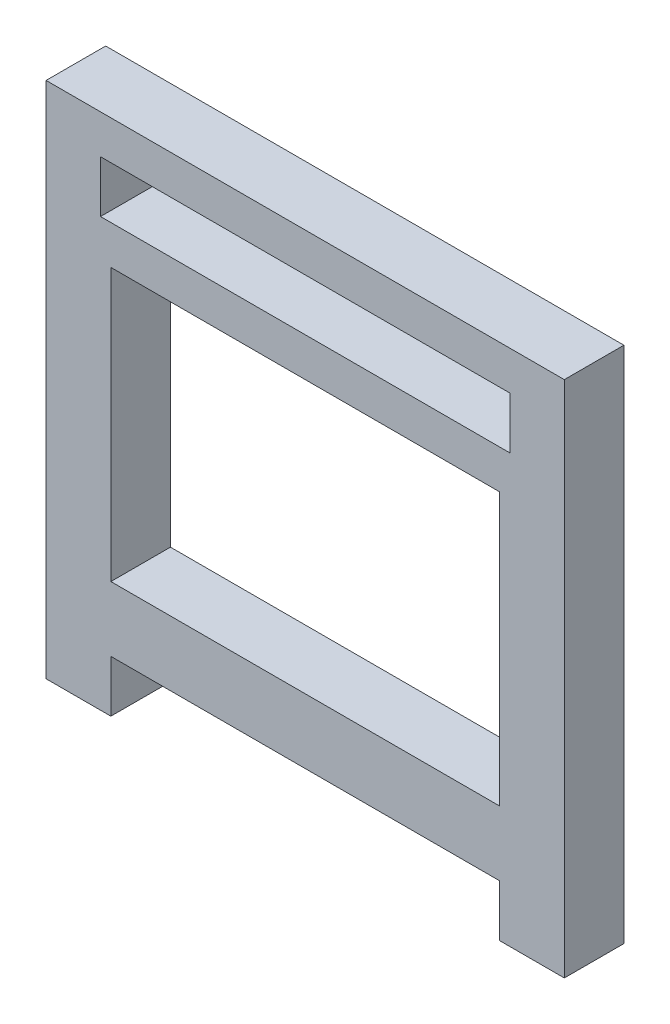
ISO-10303-21;
HEADER;
FILE_DESCRIPTION(('STEP AP214'),'2;1');
FILE_NAME('part.step','',(''),(''),'','','');
FILE_SCHEMA(('AUTOMOTIVE_DESIGN { 1 0 10303 214 1 1 1 1 }'));
ENDSEC;
DATA;
#1=APPLICATION_CONTEXT('core data for automotive mechanical design processes');
#2=APPLICATION_PROTOCOL_DEFINITION('international standard','automotive_design',2000,#1);
#3=PRODUCT_CONTEXT('',#1,'mechanical');
#4=PRODUCT('Part','Part','',(#3));
#5=PRODUCT_RELATED_PRODUCT_CATEGORY('part','',(#4));
#6=PRODUCT_DEFINITION_FORMATION('','',#4);
#7=PRODUCT_DEFINITION_CONTEXT('part definition',#1,'design');
#8=PRODUCT_DEFINITION('design','',#6,#7);
#9=PRODUCT_DEFINITION_SHAPE('','',#8);
#10=(LENGTH_UNIT() NAMED_UNIT(*) SI_UNIT(.MILLI.,.METRE.));
#11=(NAMED_UNIT(*) PLANE_ANGLE_UNIT() SI_UNIT($,.RADIAN.));
#12=(NAMED_UNIT(*) SI_UNIT($,.STERADIAN.) SOLID_ANGLE_UNIT());
#13=UNCERTAINTY_MEASURE_WITH_UNIT(LENGTH_MEASURE(1.E-05),#10,'distance_accuracy_value','');
#14=(GEOMETRIC_REPRESENTATION_CONTEXT(3) GLOBAL_UNCERTAINTY_ASSIGNED_CONTEXT((#13)) GLOBAL_UNIT_ASSIGNED_CONTEXT((#10,
#11,#12)) REPRESENTATION_CONTEXT('',''));
#15=CARTESIAN_POINT('',(0.,0.,0.));
#16=DIRECTION('',(0.,0.,1.));
#17=DIRECTION('',(1.,0.,0.));
#18=AXIS2_PLACEMENT_3D('',#15,#16,#17);
#19=CARTESIAN_POINT('',(0.,0.,2.3));
#20=DIRECTION('',(0.,0.,-1.));
#21=DIRECTION('',(-1.,0.,0.));
#22=AXIS2_PLACEMENT_3D('',#19,#20,#21);
#23=PLANE('',#22);
#24=DIRECTION('',(0.,1.,0.));
#25=VECTOR('',#24,1.);
#26=CARTESIAN_POINT('',(17.5,2.5,2.3));
#27=LINE('',#26,#25);
#28=CARTESIAN_POINT('',(17.5,2.5,2.3));
#29=VERTEX_POINT('',#28);
#30=CARTESIAN_POINT('',(17.5,13.,2.3));
#31=VERTEX_POINT('',#30);
#32=EDGE_CURVE('E207',#29,#31,#27,.T.);
#33=ORIENTED_EDGE('',*,*,#32,.F.);
#34=DIRECTION('',(1.,0.,0.));
#35=VECTOR('',#34,1.);
#36=CARTESIAN_POINT('',(2.5,2.5,2.3));
#37=LINE('',#36,#35);
#38=CARTESIAN_POINT('',(2.5,2.5,2.3));
#39=VERTEX_POINT('',#38);
#40=EDGE_CURVE('E218',#39,#29,#37,.T.);
#41=ORIENTED_EDGE('',*,*,#40,.F.);
#42=DIRECTION('',(0.,-1.,0.));
#43=VECTOR('',#42,1.);
#44=CARTESIAN_POINT('',(2.5,2.5,2.3));
#45=LINE('',#44,#43);
#46=CARTESIAN_POINT('',(2.5,13.,2.3));
#47=VERTEX_POINT('',#46);
#48=EDGE_CURVE('E214',#47,#39,#45,.T.);
#49=ORIENTED_EDGE('',*,*,#48,.F.);
#50=DIRECTION('',(-1.,0.,0.));
#51=VECTOR('',#50,1.);
#52=CARTESIAN_POINT('',(2.5,13.,2.3));
#53=LINE('',#52,#51);
#54=EDGE_CURVE('E210',#31,#47,#53,.T.);
#55=ORIENTED_EDGE('',*,*,#54,.F.);
#56=EDGE_LOOP('',(#33,#41,#49,#55));
#57=FACE_BOUND('',#56,.T.);
#58=DIRECTION('',(0.,-1.,0.));
#59=VECTOR('',#58,1.);
#60=CARTESIAN_POINT('',(0.,0.,2.3));
#61=LINE('',#60,#59);
#62=CARTESIAN_POINT('',(0.,18.,2.3));
#63=VERTEX_POINT('',#62);
#64=CARTESIAN_POINT('',(0.,-2.,2.3));
#65=VERTEX_POINT('',#64);
#66=EDGE_CURVE('E250',#63,#65,#61,.T.);
#67=ORIENTED_EDGE('',*,*,#66,.T.);
#68=DIRECTION('',(1.,0.,0.));
#69=VECTOR('',#68,1.);
#70=CARTESIAN_POINT('',(0.,-2.,2.3));
#71=LINE('',#70,#69);
#72=CARTESIAN_POINT('',(2.5,-2.,2.3));
#73=VERTEX_POINT('',#72);
#74=EDGE_CURVE('E253',#65,#73,#71,.T.);
#75=ORIENTED_EDGE('',*,*,#74,.T.);
#76=DIRECTION('',(0.,1.,0.));
#77=VECTOR('',#76,1.);
#78=CARTESIAN_POINT('',(2.5,-2.,2.3));
#79=LINE('',#78,#77);
#80=CARTESIAN_POINT('',(2.5,0.,2.3));
#81=VERTEX_POINT('',#80);
#82=EDGE_CURVE('E257',#73,#81,#79,.T.);
#83=ORIENTED_EDGE('',*,*,#82,.T.);
#84=DIRECTION('',(1.,0.,0.));
#85=VECTOR('',#84,1.);
#86=CARTESIAN_POINT('',(2.5,0.,2.3));
#87=LINE('',#86,#85);
#88=CARTESIAN_POINT('',(17.5,0.,2.3));
#89=VERTEX_POINT('',#88);
#90=EDGE_CURVE('E260',#81,#89,#87,.T.);
#91=ORIENTED_EDGE('',*,*,#90,.T.);
#92=DIRECTION('',(0.,-1.,0.));
#93=VECTOR('',#92,1.);
#94=CARTESIAN_POINT('',(17.5,-2.,2.3));
#95=LINE('',#94,#93);
#96=CARTESIAN_POINT('',(17.5,-2.,2.3));
#97=VERTEX_POINT('',#96);
#98=EDGE_CURVE('E263',#89,#97,#95,.T.);
#99=ORIENTED_EDGE('',*,*,#98,.T.);
#100=DIRECTION('',(1.,0.,0.));
#101=VECTOR('',#100,1.);
#102=CARTESIAN_POINT('',(20.,-2.,2.3));
#103=LINE('',#102,#101);
#104=CARTESIAN_POINT('',(20.,-2.,2.3));
#105=VERTEX_POINT('',#104);
#106=EDGE_CURVE('E266',#97,#105,#103,.T.);
#107=ORIENTED_EDGE('',*,*,#106,.T.);
#108=DIRECTION('',(0.,1.,0.));
#109=VECTOR('',#108,1.);
#110=CARTESIAN_POINT('',(20.,0.,2.3));
#111=LINE('',#110,#109);
#112=CARTESIAN_POINT('',(20.,18.,2.3));
#113=VERTEX_POINT('',#112);
#114=EDGE_CURVE('E269',#105,#113,#111,.T.);
#115=ORIENTED_EDGE('',*,*,#114,.T.);
#116=DIRECTION('',(-1.,0.,0.));
#117=VECTOR('',#116,1.);
#118=CARTESIAN_POINT('',(0.,18.,2.3));
#119=LINE('',#118,#117);
#120=EDGE_CURVE('E272',#113,#63,#119,.T.);
#121=ORIENTED_EDGE('',*,*,#120,.T.);
#122=EDGE_LOOP('',(#67,#75,#83,#91,#99,#107,#115,#121));
#123=FACE_BOUND('',#122,.T.);
#124=DIRECTION('',(0.,-1.,0.));
#125=VECTOR('',#124,1.);
#126=CARTESIAN_POINT('',(2.1,14.5,2.3));
#127=LINE('',#126,#125);
#128=CARTESIAN_POINT('',(2.1,16.5,2.3));
#129=VERTEX_POINT('',#128);
#130=CARTESIAN_POINT('',(2.1,14.5,2.3));
#131=VERTEX_POINT('',#130);
#132=EDGE_CURVE('E159',#129,#131,#127,.T.);
#133=ORIENTED_EDGE('',*,*,#132,.F.);
#134=DIRECTION('',(-1.,0.,0.));
#135=VECTOR('',#134,1.);
#136=CARTESIAN_POINT('',(2.1,16.5,2.3));
#137=LINE('',#136,#135);
#138=CARTESIAN_POINT('',(17.9,16.5,2.3));
#139=VERTEX_POINT('',#138);
#140=EDGE_CURVE('E185',#139,#129,#137,.T.);
#141=ORIENTED_EDGE('',*,*,#140,.F.);
#142=DIRECTION('',(0.,1.,0.));
#143=VECTOR('',#142,1.);
#144=CARTESIAN_POINT('',(17.9,14.5,2.3));
#145=LINE('',#144,#143);
#146=CARTESIAN_POINT('',(17.9,14.5,2.3));
#147=VERTEX_POINT('',#146);
#148=EDGE_CURVE('E181',#147,#139,#145,.T.);
#149=ORIENTED_EDGE('',*,*,#148,.F.);
#150=DIRECTION('',(1.,0.,0.));
#151=VECTOR('',#150,1.);
#152=CARTESIAN_POINT('',(2.1,14.5,2.3));
#153=LINE('',#152,#151);
#154=EDGE_CURVE('E168',#131,#147,#153,.T.);
#155=ORIENTED_EDGE('',*,*,#154,.F.);
#156=EDGE_LOOP('',(#133,#141,#149,#155));
#157=FACE_BOUND('',#156,.T.);
#158=ADVANCED_FACE('F45',(#57,#123,#157),#23,.F.);
#159=CARTESIAN_POINT('',(0.,0.,0.));
#160=DIRECTION('',(0.,0.,-1.));
#161=DIRECTION('',(-1.,0.,0.));
#162=AXIS2_PLACEMENT_3D('',#159,#160,#161);
#163=PLANE('',#162);
#164=DIRECTION('',(0.,-1.,0.));
#165=VECTOR('',#164,1.);
#166=CARTESIAN_POINT('',(0.,0.,0.));
#167=LINE('',#166,#165);
#168=CARTESIAN_POINT('',(0.,18.,0.));
#169=VERTEX_POINT('',#168);
#170=CARTESIAN_POINT('',(0.,-2.,0.));
#171=VERTEX_POINT('',#170);
#172=EDGE_CURVE('E249',#169,#171,#167,.T.);
#173=ORIENTED_EDGE('',*,*,#172,.F.);
#174=DIRECTION('',(-1.,0.,0.));
#175=VECTOR('',#174,1.);
#176=CARTESIAN_POINT('',(0.,18.,0.));
#177=LINE('',#176,#175);
#178=CARTESIAN_POINT('',(20.,18.,0.));
#179=VERTEX_POINT('',#178);
#180=EDGE_CURVE('E254',#179,#169,#177,.T.);
#181=ORIENTED_EDGE('',*,*,#180,.F.);
#182=DIRECTION('',(0.,1.,0.));
#183=VECTOR('',#182,1.);
#184=CARTESIAN_POINT('',(20.,0.,0.));
#185=LINE('',#184,#183);
#186=CARTESIAN_POINT('',(20.,-2.,0.));
#187=VERTEX_POINT('',#186);
#188=EDGE_CURVE('E294',#187,#179,#185,.T.);
#189=ORIENTED_EDGE('',*,*,#188,.F.);
#190=DIRECTION('',(1.,0.,0.));
#191=VECTOR('',#190,1.);
#192=CARTESIAN_POINT('',(20.,-2.,0.));
#193=LINE('',#192,#191);
#194=CARTESIAN_POINT('',(17.5,-2.,0.));
#195=VERTEX_POINT('',#194);
#196=EDGE_CURVE('E290',#195,#187,#193,.T.);
#197=ORIENTED_EDGE('',*,*,#196,.F.);
#198=DIRECTION('',(0.,-1.,0.));
#199=VECTOR('',#198,1.);
#200=CARTESIAN_POINT('',(17.5,-2.,0.));
#201=LINE('',#200,#199);
#202=CARTESIAN_POINT('',(17.5,0.,0.));
#203=VERTEX_POINT('',#202);
#204=EDGE_CURVE('E287',#203,#195,#201,.T.);
#205=ORIENTED_EDGE('',*,*,#204,.F.);
#206=DIRECTION('',(1.,0.,0.));
#207=VECTOR('',#206,1.);
#208=CARTESIAN_POINT('',(2.5,0.,0.));
#209=LINE('',#208,#207);
#210=CARTESIAN_POINT('',(2.5,0.,0.));
#211=VERTEX_POINT('',#210);
#212=EDGE_CURVE('E284',#211,#203,#209,.T.);
#213=ORIENTED_EDGE('',*,*,#212,.F.);
#214=DIRECTION('',(0.,1.,0.));
#215=VECTOR('',#214,1.);
#216=CARTESIAN_POINT('',(2.5,-2.,0.));
#217=LINE('',#216,#215);
#218=CARTESIAN_POINT('',(2.5,-2.,0.));
#219=VERTEX_POINT('',#218);
#220=EDGE_CURVE('E281',#219,#211,#217,.T.);
#221=ORIENTED_EDGE('',*,*,#220,.F.);
#222=DIRECTION('',(1.,0.,0.));
#223=VECTOR('',#222,1.);
#224=CARTESIAN_POINT('',(0.,-2.,0.));
#225=LINE('',#224,#223);
#226=EDGE_CURVE('E278',#171,#219,#225,.T.);
#227=ORIENTED_EDGE('',*,*,#226,.F.);
#228=EDGE_LOOP('',(#173,#181,#189,#197,#205,#213,#221,#227));
#229=FACE_BOUND('',#228,.T.);
#230=DIRECTION('',(1.,0.,0.));
#231=VECTOR('',#230,1.);
#232=CARTESIAN_POINT('',(2.5,2.5,0.));
#233=LINE('',#232,#231);
#234=CARTESIAN_POINT('',(2.5,2.5,0.));
#235=VERTEX_POINT('',#234);
#236=CARTESIAN_POINT('',(17.5,2.5,0.));
#237=VERTEX_POINT('',#236);
#238=EDGE_CURVE('E211',#235,#237,#233,.T.);
#239=ORIENTED_EDGE('',*,*,#238,.T.);
#240=DIRECTION('',(0.,1.,0.));
#241=VECTOR('',#240,1.);
#242=CARTESIAN_POINT('',(17.5,2.5,0.));
#243=LINE('',#242,#241);
#244=CARTESIAN_POINT('',(17.5,13.,0.));
#245=VERTEX_POINT('',#244);
#246=EDGE_CURVE('E177',#237,#245,#243,.T.);
#247=ORIENTED_EDGE('',*,*,#246,.T.);
#248=DIRECTION('',(-1.,0.,0.));
#249=VECTOR('',#248,1.);
#250=CARTESIAN_POINT('',(2.5,13.,0.));
#251=LINE('',#250,#249);
#252=CARTESIAN_POINT('',(2.5,13.,0.));
#253=VERTEX_POINT('',#252);
#254=EDGE_CURVE('E225',#245,#253,#251,.T.);
#255=ORIENTED_EDGE('',*,*,#254,.T.);
#256=DIRECTION('',(0.,-1.,0.));
#257=VECTOR('',#256,1.);
#258=CARTESIAN_POINT('',(2.5,2.5,0.));
#259=LINE('',#258,#257);
#260=EDGE_CURVE('E229',#253,#235,#259,.T.);
#261=ORIENTED_EDGE('',*,*,#260,.T.);
#262=EDGE_LOOP('',(#239,#247,#255,#261));
#263=FACE_BOUND('',#262,.T.);
#264=DIRECTION('',(-1.,0.,0.));
#265=VECTOR('',#264,1.);
#266=CARTESIAN_POINT('',(2.1,16.5,0.));
#267=LINE('',#266,#265);
#268=CARTESIAN_POINT('',(17.9,16.5,0.));
#269=VERTEX_POINT('',#268);
#270=CARTESIAN_POINT('',(2.1,16.5,0.));
#271=VERTEX_POINT('',#270);
#272=EDGE_CURVE('E169',#269,#271,#267,.T.);
#273=ORIENTED_EDGE('',*,*,#272,.T.);
#274=DIRECTION('',(0.,-1.,0.));
#275=VECTOR('',#274,1.);
#276=CARTESIAN_POINT('',(2.1,14.5,0.));
#277=LINE('',#276,#275);
#278=CARTESIAN_POINT('',(2.1,14.5,0.));
#279=VERTEX_POINT('',#278);
#280=EDGE_CURVE('E69',#271,#279,#277,.T.);
#281=ORIENTED_EDGE('',*,*,#280,.T.);
#282=DIRECTION('',(1.,0.,0.));
#283=VECTOR('',#282,1.);
#284=CARTESIAN_POINT('',(2.1,14.5,0.));
#285=LINE('',#284,#283);
#286=CARTESIAN_POINT('',(17.9,14.5,0.));
#287=VERTEX_POINT('',#286);
#288=EDGE_CURVE('E175',#279,#287,#285,.T.);
#289=ORIENTED_EDGE('',*,*,#288,.T.);
#290=DIRECTION('',(0.,1.,0.));
#291=VECTOR('',#290,1.);
#292=CARTESIAN_POINT('',(17.9,14.5,0.));
#293=LINE('',#292,#291);
#294=EDGE_CURVE('E194',#287,#269,#293,.T.);
#295=ORIENTED_EDGE('',*,*,#294,.T.);
#296=EDGE_LOOP('',(#273,#281,#289,#295));
#297=FACE_BOUND('',#296,.T.);
#298=ADVANCED_FACE('F335',(#229,#263,#297),#163,.T.);
#299=CARTESIAN_POINT('',(0.,0.,2.3));
#300=DIRECTION('',(1.,0.,0.));
#301=DIRECTION('',(0.,1.,0.));
#302=AXIS2_PLACEMENT_3D('',#299,#300,#301);
#303=PLANE('',#302);
#304=ORIENTED_EDGE('',*,*,#172,.T.);
#305=DIRECTION('',(0.,0.,-1.));
#306=VECTOR('',#305,1.);
#307=CARTESIAN_POINT('',(0.,-2.,2.3));
#308=LINE('',#307,#306);
#309=EDGE_CURVE('E11',#65,#171,#308,.T.);
#310=ORIENTED_EDGE('',*,*,#309,.F.);
#311=ORIENTED_EDGE('',*,*,#66,.F.);
#312=DIRECTION('',(0.,0.,-1.));
#313=VECTOR('',#312,1.);
#314=CARTESIAN_POINT('',(0.,18.,2.3));
#315=LINE('',#314,#313);
#316=EDGE_CURVE('E275',#63,#169,#315,.T.);
#317=ORIENTED_EDGE('',*,*,#316,.T.);
#318=EDGE_LOOP('',(#304,#310,#311,#317));
#319=FACE_BOUND('',#318,.T.);
#320=ADVANCED_FACE('F47',(#319),#303,.F.);
#321=CARTESIAN_POINT('',(0.,-2.,2.3));
#322=DIRECTION('',(0.,1.,0.));
#323=DIRECTION('',(0.,0.,1.));
#324=AXIS2_PLACEMENT_3D('',#321,#322,#323);
#325=PLANE('',#324);
#326=ORIENTED_EDGE('',*,*,#226,.T.);
#327=DIRECTION('',(0.,0.,-1.));
#328=VECTOR('',#327,1.);
#329=CARTESIAN_POINT('',(2.5,-2.,2.3));
#330=LINE('',#329,#328);
#331=EDGE_CURVE('E54',#73,#219,#330,.T.);
#332=ORIENTED_EDGE('',*,*,#331,.F.);
#333=ORIENTED_EDGE('',*,*,#74,.F.);
#334=ORIENTED_EDGE('',*,*,#309,.T.);
#335=EDGE_LOOP('',(#326,#332,#333,#334));
#336=FACE_BOUND('',#335,.T.);
#337=ADVANCED_FACE('F352',(#336),#325,.F.);
#338=CARTESIAN_POINT('',(2.5,-2.,2.3));
#339=DIRECTION('',(-1.,0.,0.));
#340=DIRECTION('',(0.,0.,1.));
#341=AXIS2_PLACEMENT_3D('',#338,#339,#340);
#342=PLANE('',#341);
#343=ORIENTED_EDGE('',*,*,#220,.T.);
#344=DIRECTION('',(0.,0.,-1.));
#345=VECTOR('',#344,1.);
#346=CARTESIAN_POINT('',(2.5,0.,2.3));
#347=LINE('',#346,#345);
#348=EDGE_CURVE('E319',#81,#211,#347,.T.);
#349=ORIENTED_EDGE('',*,*,#348,.F.);
#350=ORIENTED_EDGE('',*,*,#82,.F.);
#351=ORIENTED_EDGE('',*,*,#331,.T.);
#352=EDGE_LOOP('',(#343,#349,#350,#351));
#353=FACE_BOUND('',#352,.T.);
#354=ADVANCED_FACE('F328',(#353),#342,.F.);
#355=CARTESIAN_POINT('',(2.5,0.,2.3));
#356=DIRECTION('',(0.,1.,0.));
#357=DIRECTION('',(0.,0.,1.));
#358=AXIS2_PLACEMENT_3D('',#355,#356,#357);
#359=PLANE('',#358);
#360=ORIENTED_EDGE('',*,*,#212,.T.);
#361=DIRECTION('',(0.,0.,-1.));
#362=VECTOR('',#361,1.);
#363=CARTESIAN_POINT('',(17.5,0.,2.3));
#364=LINE('',#363,#362);
#365=EDGE_CURVE('E315',#89,#203,#364,.T.);
#366=ORIENTED_EDGE('',*,*,#365,.F.);
#367=ORIENTED_EDGE('',*,*,#90,.F.);
#368=ORIENTED_EDGE('',*,*,#348,.T.);
#369=EDGE_LOOP('',(#360,#366,#367,#368));
#370=FACE_BOUND('',#369,.T.);
#371=ADVANCED_FACE('F341',(#370),#359,.F.);
#372=CARTESIAN_POINT('',(17.5,-2.,2.3));
#373=DIRECTION('',(1.,0.,0.));
#374=DIRECTION('',(0.,0.,-1.));
#375=AXIS2_PLACEMENT_3D('',#372,#373,#374);
#376=PLANE('',#375);
#377=ORIENTED_EDGE('',*,*,#204,.T.);
#378=DIRECTION('',(0.,0.,-1.));
#379=VECTOR('',#378,1.);
#380=CARTESIAN_POINT('',(17.5,-2.,2.3));
#381=LINE('',#380,#379);
#382=EDGE_CURVE('E311',#97,#195,#381,.T.);
#383=ORIENTED_EDGE('',*,*,#382,.F.);
#384=ORIENTED_EDGE('',*,*,#98,.F.);
#385=ORIENTED_EDGE('',*,*,#365,.T.);
#386=EDGE_LOOP('',(#377,#383,#384,#385));
#387=FACE_BOUND('',#386,.T.);
#388=ADVANCED_FACE('F345',(#387),#376,.F.);
#389=CARTESIAN_POINT('',(20.,-2.,2.3));
#390=DIRECTION('',(0.,1.,0.));
#391=DIRECTION('',(-1.,0.,0.));
#392=AXIS2_PLACEMENT_3D('',#389,#390,#391);
#393=PLANE('',#392);
#394=ORIENTED_EDGE('',*,*,#196,.T.);
#395=DIRECTION('',(0.,0.,-1.));
#396=VECTOR('',#395,1.);
#397=CARTESIAN_POINT('',(20.,-2.,2.3));
#398=LINE('',#397,#396);
#399=EDGE_CURVE('E307',#105,#187,#398,.T.);
#400=ORIENTED_EDGE('',*,*,#399,.F.);
#401=ORIENTED_EDGE('',*,*,#106,.F.);
#402=ORIENTED_EDGE('',*,*,#382,.T.);
#403=EDGE_LOOP('',(#394,#400,#401,#402));
#404=FACE_BOUND('',#403,.T.);
#405=ADVANCED_FACE('F364',(#404),#393,.F.);
#406=CARTESIAN_POINT('',(20.,0.,2.3));
#407=DIRECTION('',(-1.,0.,0.));
#408=DIRECTION('',(0.,0.,1.));
#409=AXIS2_PLACEMENT_3D('',#406,#407,#408);
#410=PLANE('',#409);
#411=ORIENTED_EDGE('',*,*,#188,.T.);
#412=DIRECTION('',(0.,0.,-1.));
#413=VECTOR('',#412,1.);
#414=CARTESIAN_POINT('',(20.,18.,2.3));
#415=LINE('',#414,#413);
#416=EDGE_CURVE('E303',#113,#179,#415,.T.);
#417=ORIENTED_EDGE('',*,*,#416,.F.);
#418=ORIENTED_EDGE('',*,*,#114,.F.);
#419=ORIENTED_EDGE('',*,*,#399,.T.);
#420=EDGE_LOOP('',(#411,#417,#418,#419));
#421=FACE_BOUND('',#420,.T.);
#422=ADVANCED_FACE('F362',(#421),#410,.F.);
#423=CARTESIAN_POINT('',(0.,18.,2.3));
#424=DIRECTION('',(0.,-1.,0.));
#425=DIRECTION('',(0.,0.,-1.));
#426=AXIS2_PLACEMENT_3D('',#423,#424,#425);
#427=PLANE('',#426);
#428=ORIENTED_EDGE('',*,*,#180,.T.);
#429=ORIENTED_EDGE('',*,*,#316,.F.);
#430=ORIENTED_EDGE('',*,*,#120,.F.);
#431=ORIENTED_EDGE('',*,*,#416,.T.);
#432=EDGE_LOOP('',(#428,#429,#430,#431));
#433=FACE_BOUND('',#432,.T.);
#434=ADVANCED_FACE('F357',(#433),#427,.F.);
#435=CARTESIAN_POINT('',(17.5,2.5,2.3));
#436=DIRECTION('',(-1.,0.,0.));
#437=DIRECTION('',(0.,0.,1.));
#438=AXIS2_PLACEMENT_3D('',#435,#436,#437);
#439=PLANE('',#438);
#440=ORIENTED_EDGE('',*,*,#246,.F.);
#441=DIRECTION('',(0.,0.,-1.));
#442=VECTOR('',#441,1.);
#443=CARTESIAN_POINT('',(17.5,2.5,2.3));
#444=LINE('',#443,#442);
#445=EDGE_CURVE('E221',#29,#237,#444,.T.);
#446=ORIENTED_EDGE('',*,*,#445,.F.);
#447=ORIENTED_EDGE('',*,*,#32,.T.);
#448=DIRECTION('',(0.,0.,-1.));
#449=VECTOR('',#448,1.);
#450=CARTESIAN_POINT('',(17.5,13.,2.3));
#451=LINE('',#450,#449);
#452=EDGE_CURVE('E245',#31,#245,#451,.T.);
#453=ORIENTED_EDGE('',*,*,#452,.T.);
#454=EDGE_LOOP('',(#440,#446,#447,#453));
#455=FACE_BOUND('',#454,.T.);
#456=ADVANCED_FACE('F382',(#455),#439,.T.);
#457=CARTESIAN_POINT('',(2.5,13.,2.3));
#458=DIRECTION('',(0.,-1.,0.));
#459=DIRECTION('',(0.,0.,-1.));
#460=AXIS2_PLACEMENT_3D('',#457,#458,#459);
#461=PLANE('',#460);
#462=ORIENTED_EDGE('',*,*,#254,.F.);
#463=ORIENTED_EDGE('',*,*,#452,.F.);
#464=ORIENTED_EDGE('',*,*,#54,.T.);
#465=DIRECTION('',(0.,0.,-1.));
#466=VECTOR('',#465,1.);
#467=CARTESIAN_POINT('',(2.5,13.,2.3));
#468=LINE('',#467,#466);
#469=EDGE_CURVE('E242',#47,#253,#468,.T.);
#470=ORIENTED_EDGE('',*,*,#469,.T.);
#471=EDGE_LOOP('',(#462,#463,#464,#470));
#472=FACE_BOUND('',#471,.T.);
#473=ADVANCED_FACE('F389',(#472),#461,.T.);
#474=CARTESIAN_POINT('',(2.5,2.5,2.3));
#475=DIRECTION('',(1.,0.,0.));
#476=DIRECTION('',(0.,0.,-1.));
#477=AXIS2_PLACEMENT_3D('',#474,#475,#476);
#478=PLANE('',#477);
#479=ORIENTED_EDGE('',*,*,#260,.F.);
#480=ORIENTED_EDGE('',*,*,#469,.F.);
#481=ORIENTED_EDGE('',*,*,#48,.T.);
#482=DIRECTION('',(0.,0.,-1.));
#483=VECTOR('',#482,1.);
#484=CARTESIAN_POINT('',(2.5,2.5,2.3));
#485=LINE('',#484,#483);
#486=EDGE_CURVE('E239',#39,#235,#485,.T.);
#487=ORIENTED_EDGE('',*,*,#486,.T.);
#488=EDGE_LOOP('',(#479,#480,#481,#487));
#489=FACE_BOUND('',#488,.T.);
#490=ADVANCED_FACE('F394',(#489),#478,.T.);
#491=CARTESIAN_POINT('',(2.5,2.5,2.3));
#492=DIRECTION('',(0.,1.,0.));
#493=DIRECTION('',(0.,0.,1.));
#494=AXIS2_PLACEMENT_3D('',#491,#492,#493);
#495=PLANE('',#494);
#496=ORIENTED_EDGE('',*,*,#238,.F.);
#497=ORIENTED_EDGE('',*,*,#486,.F.);
#498=ORIENTED_EDGE('',*,*,#40,.T.);
#499=ORIENTED_EDGE('',*,*,#445,.T.);
#500=EDGE_LOOP('',(#496,#497,#498,#499));
#501=FACE_BOUND('',#500,.T.);
#502=ADVANCED_FACE('F400',(#501),#495,.T.);
#503=CARTESIAN_POINT('',(2.1,14.5,2.3));
#504=DIRECTION('',(1.,0.,0.));
#505=DIRECTION('',(0.,0.,-1.));
#506=AXIS2_PLACEMENT_3D('',#503,#504,#505);
#507=PLANE('',#506);
#508=ORIENTED_EDGE('',*,*,#280,.F.);
#509=DIRECTION('',(0.,0.,-1.));
#510=VECTOR('',#509,1.);
#511=CARTESIAN_POINT('',(2.1,16.5,2.3));
#512=LINE('',#511,#510);
#513=EDGE_CURVE('E163',#129,#271,#512,.T.);
#514=ORIENTED_EDGE('',*,*,#513,.F.);
#515=ORIENTED_EDGE('',*,*,#132,.T.);
#516=DIRECTION('',(0.,0.,-1.));
#517=VECTOR('',#516,1.);
#518=CARTESIAN_POINT('',(2.1,14.5,2.3));
#519=LINE('',#518,#517);
#520=EDGE_CURVE('E162',#131,#279,#519,.T.);
#521=ORIENTED_EDGE('',*,*,#520,.T.);
#522=EDGE_LOOP('',(#508,#514,#515,#521));
#523=FACE_BOUND('',#522,.T.);
#524=ADVANCED_FACE('F161',(#523),#507,.T.);
#525=CARTESIAN_POINT('',(2.1,14.5,2.3));
#526=DIRECTION('',(0.,1.,0.));
#527=DIRECTION('',(0.,0.,1.));
#528=AXIS2_PLACEMENT_3D('',#525,#526,#527);
#529=PLANE('',#528);
#530=ORIENTED_EDGE('',*,*,#288,.F.);
#531=ORIENTED_EDGE('',*,*,#520,.F.);
#532=ORIENTED_EDGE('',*,*,#154,.T.);
#533=DIRECTION('',(0.,0.,-1.));
#534=VECTOR('',#533,1.);
#535=CARTESIAN_POINT('',(17.9,14.5,2.3));
#536=LINE('',#535,#534);
#537=EDGE_CURVE('E178',#147,#287,#536,.T.);
#538=ORIENTED_EDGE('',*,*,#537,.T.);
#539=EDGE_LOOP('',(#530,#531,#532,#538));
#540=FACE_BOUND('',#539,.T.);
#541=ADVANCED_FACE('F172',(#540),#529,.T.);
#542=CARTESIAN_POINT('',(17.9,14.5,2.3));
#543=DIRECTION('',(-1.,0.,0.));
#544=DIRECTION('',(0.,0.,1.));
#545=AXIS2_PLACEMENT_3D('',#542,#543,#544);
#546=PLANE('',#545);
#547=ORIENTED_EDGE('',*,*,#294,.F.);
#548=ORIENTED_EDGE('',*,*,#537,.F.);
#549=ORIENTED_EDGE('',*,*,#148,.T.);
#550=DIRECTION('',(0.,0.,-1.));
#551=VECTOR('',#550,1.);
#552=CARTESIAN_POINT('',(17.9,16.5,2.3));
#553=LINE('',#552,#551);
#554=EDGE_CURVE('E61',#139,#269,#553,.T.);
#555=ORIENTED_EDGE('',*,*,#554,.T.);
#556=EDGE_LOOP('',(#547,#548,#549,#555));
#557=FACE_BOUND('',#556,.T.);
#558=ADVANCED_FACE('F419',(#557),#546,.T.);
#559=CARTESIAN_POINT('',(2.1,16.5,2.3));
#560=DIRECTION('',(0.,-1.,0.));
#561=DIRECTION('',(0.,0.,-1.));
#562=AXIS2_PLACEMENT_3D('',#559,#560,#561);
#563=PLANE('',#562);
#564=ORIENTED_EDGE('',*,*,#272,.F.);
#565=ORIENTED_EDGE('',*,*,#554,.F.);
#566=ORIENTED_EDGE('',*,*,#140,.T.);
#567=ORIENTED_EDGE('',*,*,#513,.T.);
#568=EDGE_LOOP('',(#564,#565,#566,#567));
#569=FACE_BOUND('',#568,.T.);
#570=ADVANCED_FACE('F422',(#569),#563,.T.);
#571=CLOSED_SHELL('',(#158,#298,#320,#337,#354,#371,#388,#405,#422,#434,#456,#473,#490,#502,
#524,#541,#558,#570));
#572=MANIFOLD_SOLID_BREP('B2',#571);
#573=ADVANCED_BREP_SHAPE_REPRESENTATION('',(#18,#572),#14);
#574=SHAPE_DEFINITION_REPRESENTATION(#9,#573);
ENDSEC;
END-ISO-10303-21;
